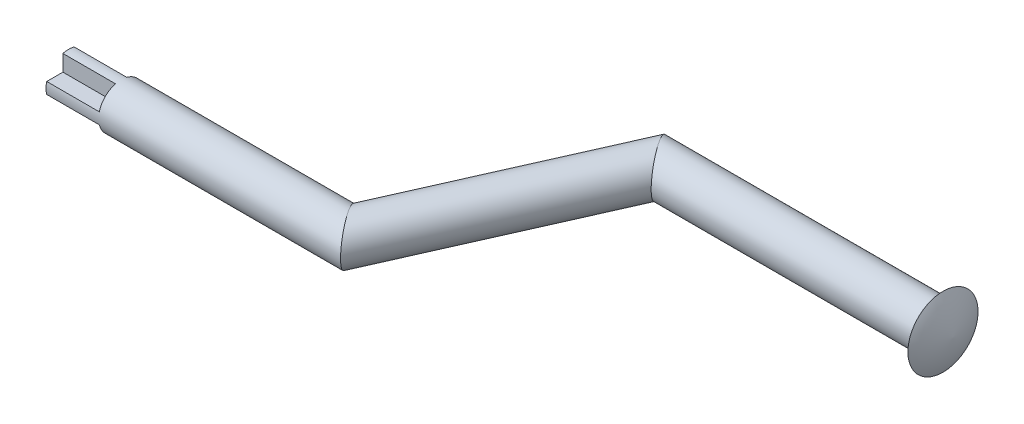
ISO-10303-21;
HEADER;
FILE_DESCRIPTION(('STEP AP214'),'2;1');
FILE_NAME('part.step','',(''),(''),'','','');
FILE_SCHEMA(('AUTOMOTIVE_DESIGN { 1 0 10303 214 1 1 1 1 }'));
ENDSEC;
DATA;
#1=APPLICATION_CONTEXT('core data for automotive mechanical design processes');
#2=APPLICATION_PROTOCOL_DEFINITION('international standard','automotive_design',2000,#1);
#3=PRODUCT_CONTEXT('',#1,'mechanical');
#4=PRODUCT('Part','Part','',(#3));
#5=PRODUCT_RELATED_PRODUCT_CATEGORY('part','',(#4));
#6=PRODUCT_DEFINITION_FORMATION('','',#4);
#7=PRODUCT_DEFINITION_CONTEXT('part definition',#1,'design');
#8=PRODUCT_DEFINITION('design','',#6,#7);
#9=PRODUCT_DEFINITION_SHAPE('','',#8);
#10=(LENGTH_UNIT() NAMED_UNIT(*) SI_UNIT(.MILLI.,.METRE.));
#11=(NAMED_UNIT(*) PLANE_ANGLE_UNIT() SI_UNIT($,.RADIAN.));
#12=(NAMED_UNIT(*) SI_UNIT($,.STERADIAN.) SOLID_ANGLE_UNIT());
#13=UNCERTAINTY_MEASURE_WITH_UNIT(LENGTH_MEASURE(1.E-05),#10,'distance_accuracy_value','');
#14=(GEOMETRIC_REPRESENTATION_CONTEXT(3) GLOBAL_UNCERTAINTY_ASSIGNED_CONTEXT((#13)) GLOBAL_UNIT_ASSIGNED_CONTEXT((#10,
#11,#12)) REPRESENTATION_CONTEXT('',''));
#15=CARTESIAN_POINT('',(0.,0.,0.));
#16=DIRECTION('',(0.,0.,1.));
#17=DIRECTION('',(1.,0.,0.));
#18=AXIS2_PLACEMENT_3D('',#15,#16,#17);
#19=CARTESIAN_POINT('',(-222.882267398916,0.,72.7461736455126));
#20=DIRECTION('',(1.,0.,0.));
#21=DIRECTION('',(0.,0.,-1.));
#22=AXIS2_PLACEMENT_3D('',#19,#20,#21);
#23=PLANE('',#22);
#24=DIRECTION('',(0.,0.,1.));
#25=VECTOR('',#24,1.);
#26=CARTESIAN_POINT('',(-222.882267398916,-1.905,65.3681403709875));
#27=LINE('',#26,#25);
#28=CARTESIAN_POINT('',(-222.882267398916,-1.905,65.3681403709875));
#29=VERTEX_POINT('',#28);
#30=CARTESIAN_POINT('',(-222.882267398916,-1.905,70.8411736455126));
#31=VERTEX_POINT('',#30);
#32=EDGE_CURVE('E146',#29,#31,#27,.T.);
#33=ORIENTED_EDGE('',*,*,#32,.T.);
#34=DIRECTION('',(0.,-1.,0.));
#35=VECTOR('',#34,1.);
#36=CARTESIAN_POINT('',(-222.882267398916,-1.905,70.8411736455126));
#37=LINE('',#36,#35);
#38=CARTESIAN_POINT('',(-222.882267398916,-7.37803327452513,70.8411736455126));
#39=VERTEX_POINT('',#38);
#40=EDGE_CURVE('E390',#31,#39,#37,.T.);
#41=ORIENTED_EDGE('',*,*,#40,.T.);
#42=CARTESIAN_POINT('',(-222.882267398916,0.,72.7461736455126));
#43=DIRECTION('',(1.,0.,0.));
#44=DIRECTION('',(0.,0.,-1.));
#45=AXIS2_PLACEMENT_3D('',#42,#43,#44);
#46=CIRCLE('',#45,7.62);
#47=CARTESIAN_POINT('',(-222.882267398916,-7.37803327452513,74.6511736455126));
#48=VERTEX_POINT('',#47);
#49=EDGE_CURVE('E152',#48,#39,#46,.T.);
#50=ORIENTED_EDGE('',*,*,#49,.F.);
#51=DIRECTION('',(0.,1.,0.));
#52=VECTOR('',#51,1.);
#53=CARTESIAN_POINT('',(-222.882267398916,-1.905,74.6511736455126));
#54=LINE('',#53,#52);
#55=CARTESIAN_POINT('',(-222.882267398916,-1.905,74.6511736455126));
#56=VERTEX_POINT('',#55);
#57=EDGE_CURVE('E181',#48,#56,#54,.T.);
#58=ORIENTED_EDGE('',*,*,#57,.T.);
#59=DIRECTION('',(0.,0.,1.));
#60=VECTOR('',#59,1.);
#61=CARTESIAN_POINT('',(-222.882267398916,-1.905,80.1242069200378));
#62=LINE('',#61,#60);
#63=CARTESIAN_POINT('',(-222.882267398916,-1.905,80.1242069200378));
#64=VERTEX_POINT('',#63);
#65=EDGE_CURVE('E172',#56,#64,#62,.T.);
#66=ORIENTED_EDGE('',*,*,#65,.T.);
#67=CARTESIAN_POINT('',(-222.882267398916,1.905,80.1242069200378));
#68=VERTEX_POINT('',#67);
#69=EDGE_CURVE('E39',#68,#64,#46,.T.);
#70=ORIENTED_EDGE('',*,*,#69,.F.);
#71=DIRECTION('',(0.,0.,1.));
#72=VECTOR('',#71,1.);
#73=CARTESIAN_POINT('',(-222.882267398916,1.905,80.1242069200378));
#74=LINE('',#73,#72);
#75=CARTESIAN_POINT('',(-222.882267398916,1.905,74.6511736455126));
#76=VERTEX_POINT('',#75);
#77=EDGE_CURVE('E200',#76,#68,#74,.T.);
#78=ORIENTED_EDGE('',*,*,#77,.F.);
#79=DIRECTION('',(0.,-1.,0.));
#80=VECTOR('',#79,1.);
#81=CARTESIAN_POINT('',(-222.882267398916,1.905,74.6511736455126));
#82=LINE('',#81,#80);
#83=CARTESIAN_POINT('',(-222.882267398916,7.37803327452513,74.6511736455126));
#84=VERTEX_POINT('',#83);
#85=EDGE_CURVE('E192',#84,#76,#82,.T.);
#86=ORIENTED_EDGE('',*,*,#85,.F.);
#87=CARTESIAN_POINT('',(-222.882267398916,7.37803327452513,70.8411736455126));
#88=VERTEX_POINT('',#87);
#89=EDGE_CURVE('E219',#88,#84,#46,.T.);
#90=ORIENTED_EDGE('',*,*,#89,.F.);
#91=DIRECTION('',(0.,1.,0.));
#92=VECTOR('',#91,1.);
#93=CARTESIAN_POINT('',(-222.882267398916,1.905,70.8411736455126));
#94=LINE('',#93,#92);
#95=CARTESIAN_POINT('',(-222.882267398916,1.905,70.8411736455126));
#96=VERTEX_POINT('',#95);
#97=EDGE_CURVE('E161',#96,#88,#94,.T.);
#98=ORIENTED_EDGE('',*,*,#97,.F.);
#99=DIRECTION('',(0.,0.,1.));
#100=VECTOR('',#99,1.);
#101=CARTESIAN_POINT('',(-222.882267398916,1.905,65.3681403709875));
#102=LINE('',#101,#100);
#103=CARTESIAN_POINT('',(-222.882267398916,1.905,65.3681403709875));
#104=VERTEX_POINT('',#103);
#105=EDGE_CURVE('E165',#104,#96,#102,.T.);
#106=ORIENTED_EDGE('',*,*,#105,.F.);
#107=EDGE_CURVE('E226',#29,#104,#46,.T.);
#108=ORIENTED_EDGE('',*,*,#107,.F.);
#109=EDGE_LOOP('',(#33,#41,#50,#58,#66,#70,#78,#86,#90,#98,#106,#108));
#110=FACE_BOUND('',#109,.T.);
#111=ADVANCED_FACE('F36',(#110),#23,.F.);
#112=CARTESIAN_POINT('',(-122.700996640822,0.,72.7461736455126));
#113=DIRECTION('',(-1.,0.,0.));
#114=DIRECTION('',(0.,0.,1.));
#115=AXIS2_PLACEMENT_3D('',#112,#113,#114);
#116=CYLINDRICAL_SURFACE('',#115,7.62);
#117=CARTESIAN_POINT('',(-128.252610357535,0.,72.7461736455126));
#118=DIRECTION('',(-0.838292149650602,0.,0.545221305374408));
#119=DIRECTION('',(0.545221305374408,0.,0.838292149650602));
#120=AXIS2_PLACEMENT_3D('',#117,#118,#119);
#121=ELLIPSE('',#120,9.08990976854071,7.62);
#122=CARTESIAN_POINT('',(-123.296597887796,0.,80.3661736455126));
#123=VERTEX_POINT('',#122);
#124=EDGE_CURVE('E221',#123,#123,#121,.T.);
#125=ORIENTED_EDGE('',*,*,#124,.T.);
#126=EDGE_LOOP('',(#125));
#127=FACE_BOUND('',#126,.T.);
#128=DIRECTION('',(-1.,0.,0.));
#129=VECTOR('',#128,1.);
#130=CARTESIAN_POINT('',(-205.102267398916,-1.905,65.3681403709875));
#131=LINE('',#130,#129);
#132=CARTESIAN_POINT('',(-205.102267398916,-1.90499999999999,65.3681403709875));
#133=VERTEX_POINT('',#132);
#134=EDGE_CURVE('E52',#133,#29,#131,.T.);
#135=ORIENTED_EDGE('',*,*,#134,.T.);
#136=ORIENTED_EDGE('',*,*,#107,.T.);
#137=DIRECTION('',(-1.,0.,0.));
#138=VECTOR('',#137,1.);
#139=CARTESIAN_POINT('',(-205.102267398916,1.905,65.3681403709875));
#140=LINE('',#139,#138);
#141=CARTESIAN_POINT('',(-205.102267398916,1.905,65.3681403709875));
#142=VERTEX_POINT('',#141);
#143=EDGE_CURVE('E164',#142,#104,#140,.T.);
#144=ORIENTED_EDGE('',*,*,#143,.F.);
#145=CARTESIAN_POINT('',(-205.102267398916,0.,72.7461736455126));
#146=DIRECTION('',(-1.,0.,0.));
#147=DIRECTION('',(0.,0.,-1.));
#148=AXIS2_PLACEMENT_3D('',#145,#146,#147);
#149=CIRCLE('',#148,7.62000000000001);
#150=CARTESIAN_POINT('',(-205.102267398916,7.37803327452513,70.8411736455126));
#151=VERTEX_POINT('',#150);
#152=EDGE_CURVE('E158',#151,#142,#149,.T.);
#153=ORIENTED_EDGE('',*,*,#152,.F.);
#154=DIRECTION('',(-1.,0.,0.));
#155=VECTOR('',#154,1.);
#156=CARTESIAN_POINT('',(-205.102267398916,7.37803327452513,70.8411736455126));
#157=LINE('',#156,#155);
#158=EDGE_CURVE('E169',#151,#88,#157,.T.);
#159=ORIENTED_EDGE('',*,*,#158,.T.);
#160=ORIENTED_EDGE('',*,*,#89,.T.);
#161=DIRECTION('',(-1.,0.,0.));
#162=VECTOR('',#161,1.);
#163=CARTESIAN_POINT('',(-205.102267398916,7.37803327452513,74.6511736455126));
#164=LINE('',#163,#162);
#165=CARTESIAN_POINT('',(-205.102267398916,7.37803327452513,74.6511736455126));
#166=VERTEX_POINT('',#165);
#167=EDGE_CURVE('E205',#166,#84,#164,.T.);
#168=ORIENTED_EDGE('',*,*,#167,.F.);
#169=CARTESIAN_POINT('',(-205.102267398916,0.,72.7461736455126));
#170=DIRECTION('',(-1.,0.,0.));
#171=DIRECTION('',(0.,0.,-1.));
#172=AXIS2_PLACEMENT_3D('',#169,#170,#171);
#173=CIRCLE('',#172,7.62000000000001);
#174=CARTESIAN_POINT('',(-205.102267398916,1.905,80.1242069200378));
#175=VERTEX_POINT('',#174);
#176=EDGE_CURVE('E196',#175,#166,#173,.T.);
#177=ORIENTED_EDGE('',*,*,#176,.F.);
#178=DIRECTION('',(-1.,0.,0.));
#179=VECTOR('',#178,1.);
#180=CARTESIAN_POINT('',(-205.102267398916,1.905,80.1242069200378));
#181=LINE('',#180,#179);
#182=EDGE_CURVE('E209',#175,#68,#181,.T.);
#183=ORIENTED_EDGE('',*,*,#182,.T.);
#184=ORIENTED_EDGE('',*,*,#69,.T.);
#185=DIRECTION('',(-1.,0.,0.));
#186=VECTOR('',#185,1.);
#187=CARTESIAN_POINT('',(-205.102267398916,-1.905,80.1242069200378));
#188=LINE('',#187,#186);
#189=CARTESIAN_POINT('',(-205.102267398916,-1.905,80.1242069200378));
#190=VERTEX_POINT('',#189);
#191=EDGE_CURVE('E185',#190,#64,#188,.T.);
#192=ORIENTED_EDGE('',*,*,#191,.F.);
#193=CARTESIAN_POINT('',(-205.102267398916,0.,72.7461736455126));
#194=DIRECTION('',(1.,0.,0.));
#195=DIRECTION('',(0.,0.,-1.));
#196=AXIS2_PLACEMENT_3D('',#193,#194,#195);
#197=CIRCLE('',#196,7.62000000000001);
#198=CARTESIAN_POINT('',(-205.102267398916,-7.37803327452513,74.6511736455126));
#199=VERTEX_POINT('',#198);
#200=EDGE_CURVE('E177',#190,#199,#197,.T.);
#201=ORIENTED_EDGE('',*,*,#200,.T.);
#202=DIRECTION('',(-1.,0.,0.));
#203=VECTOR('',#202,1.);
#204=CARTESIAN_POINT('',(-205.102267398916,-7.37803327452513,74.6511736455126));
#205=LINE('',#204,#203);
#206=EDGE_CURVE('E190',#199,#48,#205,.T.);
#207=ORIENTED_EDGE('',*,*,#206,.T.);
#208=ORIENTED_EDGE('',*,*,#49,.T.);
#209=DIRECTION('',(-1.,0.,0.));
#210=VECTOR('',#209,1.);
#211=CARTESIAN_POINT('',(-205.102267398916,-7.37803327452513,70.8411736455126));
#212=LINE('',#211,#210);
#213=CARTESIAN_POINT('',(-205.102267398916,-7.37803327452513,70.8411736455126));
#214=VERTEX_POINT('',#213);
#215=EDGE_CURVE('E136',#214,#39,#212,.T.);
#216=ORIENTED_EDGE('',*,*,#215,.F.);
#217=CARTESIAN_POINT('',(-205.102267398916,0.,72.7461736455126));
#218=DIRECTION('',(1.,0.,0.));
#219=DIRECTION('',(0.,0.,-1.));
#220=AXIS2_PLACEMENT_3D('',#217,#218,#219);
#221=CIRCLE('',#220,7.62000000000001);
#222=EDGE_CURVE('E141',#214,#133,#221,.T.);
#223=ORIENTED_EDGE('',*,*,#222,.T.);
#224=EDGE_LOOP('',(#135,#136,#144,#153,#159,#160,#168,#177,#183,#184,#192,#201,#207,#208,#216,#223));
#225=FACE_BOUND('',#224,.T.);
#226=ADVANCED_FACE('F149',(#127,#225),#116,.T.);
#227=CARTESIAN_POINT('',(-93.7339165765986,0.,-5.07478272905161));
#228=DIRECTION('',(-0.405467456331653,0.,0.914109480235239));
#229=DIRECTION('',(0.914109480235239,0.,0.405467456331653));
#230=AXIS2_PLACEMENT_3D('',#227,#228,#229);
#231=CYLINDRICAL_SURFACE('',#230,7.62);
#232=CARTESIAN_POINT('',(-95.9849152688503,0.,0.));
#233=DIRECTION('',(-0.838292149650602,0.,0.545221305374408));
#234=DIRECTION('',(-0.545221305374408,0.,-0.838292149650602));
#235=AXIS2_PLACEMENT_3D('',#232,#233,#234);
#236=ELLIPSE('',#235,9.08990976854071,7.62);
#237=CARTESIAN_POINT('',(-100.94092773859,0.,-7.62));
#238=VERTEX_POINT('',#237);
#239=EDGE_CURVE('E11',#238,#238,#236,.T.);
#240=ORIENTED_EDGE('',*,*,#239,.T.);
#241=EDGE_LOOP('',(#240));
#242=FACE_BOUND('',#241,.T.);
#243=ORIENTED_EDGE('',*,*,#124,.F.);
#244=EDGE_LOOP('',(#243));
#245=FACE_BOUND('',#244,.T.);
#246=ADVANCED_FACE('F265',(#242,#245),#231,.T.);
#247=CARTESIAN_POINT('',(0.,0.,0.));
#248=DIRECTION('',(-1.,0.,0.));
#249=DIRECTION('',(0.,0.,1.));
#250=AXIS2_PLACEMENT_3D('',#247,#248,#249);
#251=CYLINDRICAL_SURFACE('',#250,7.62);
#252=CARTESIAN_POINT('',(0.,0.,0.));
#253=DIRECTION('',(1.,0.,0.));
#254=DIRECTION('',(0.,0.,-1.));
#255=AXIS2_PLACEMENT_3D('',#252,#253,#254);
#256=CIRCLE('',#255,7.62);
#257=CARTESIAN_POINT('',(0.,0.,-7.62));
#258=VERTEX_POINT('',#257);
#259=EDGE_CURVE('E44',#258,#258,#256,.T.);
#260=ORIENTED_EDGE('',*,*,#259,.F.);
#261=EDGE_LOOP('',(#260));
#262=FACE_BOUND('',#261,.T.);
#263=ORIENTED_EDGE('',*,*,#239,.F.);
#264=EDGE_LOOP('',(#263));
#265=FACE_BOUND('',#264,.T.);
#266=ADVANCED_FACE('F266',(#262,#265),#251,.T.);
#267=CARTESIAN_POINT('',(0.,0.,0.));
#268=DIRECTION('',(1.,0.,0.));
#269=DIRECTION('',(0.,0.,-1.));
#270=AXIS2_PLACEMENT_3D('',#267,#268,#269);
#271=PLANE('',#270);
#272=ORIENTED_EDGE('',*,*,#259,.T.);
#273=EDGE_LOOP('',(#272));
#274=FACE_BOUND('',#273,.T.);
#275=CARTESIAN_POINT('',(0.,0.,0.));
#276=DIRECTION('',(-1.,0.,0.));
#277=DIRECTION('',(0.,0.,1.));
#278=AXIS2_PLACEMENT_3D('',#275,#276,#277);
#279=CIRCLE('',#278,11.8604605662378);
#280=CARTESIAN_POINT('',(0.,0.,11.8604605662378));
#281=VERTEX_POINT('',#280);
#282=EDGE_CURVE('E212',#281,#281,#279,.T.);
#283=ORIENTED_EDGE('',*,*,#282,.T.);
#284=EDGE_LOOP('',(#283));
#285=FACE_BOUND('',#284,.T.);
#286=ADVANCED_FACE('F272',(#274,#285),#271,.F.);
#287=CARTESIAN_POINT('',(-27.0940917383905,0.,-2.34195249865787));
#288=DIRECTION('',(0.,-1.,0.));
#289=DIRECTION('',(0.,0.,1.));
#290=AXIS2_PLACEMENT_3D('',#287,#288,#289);
#291=CIRCLE('',#290,30.5908212376562);
#292=TRIMMED_CURVE('',#291,(PARAMETER_VALUE(-1.49416398521679)),
(PARAMETER_VALUE(1.49416398521679)),.T.,.PARAMETER.);
#293=CARTESIAN_POINT('',(-27.0940917383905,0.,0.));
#294=DIRECTION('',(-1.,0.,0.));
#295=AXIS1_PLACEMENT('',#293,#294);
#296=SURFACE_OF_REVOLUTION('',#292,#295);
#297=ORIENTED_EDGE('',*,*,#282,.F.);
#298=EDGE_LOOP('',(#297));
#299=FACE_BOUND('',#298,.T.);
#300=CARTESIAN_POINT('',(3.40695090753014,0.,0.));
#301=VERTEX_POINT('',#300);
#302=VERTEX_LOOP('',#301);
#303=FACE_BOUND('',#302,.T.);
#304=ADVANCED_FACE('F279',(#299,#303),#296,.T.);
#305=CARTESIAN_POINT('',(-205.102267398916,1.905,80.1242069200378));
#306=DIRECTION('',(0.,-1.,0.));
#307=DIRECTION('',(0.,0.,-1.));
#308=AXIS2_PLACEMENT_3D('',#305,#306,#307);
#309=PLANE('',#308);
#310=ORIENTED_EDGE('',*,*,#77,.T.);
#311=ORIENTED_EDGE('',*,*,#182,.F.);
#312=DIRECTION('',(0.,0.,1.));
#313=VECTOR('',#312,1.);
#314=CARTESIAN_POINT('',(-205.102267398916,1.905,80.1242069200378));
#315=LINE('',#314,#313);
#316=CARTESIAN_POINT('',(-205.102267398916,1.905,74.6511736455126));
#317=VERTEX_POINT('',#316);
#318=EDGE_CURVE('E203',#317,#175,#315,.T.);
#319=ORIENTED_EDGE('',*,*,#318,.F.);
#320=DIRECTION('',(-1.,0.,0.));
#321=VECTOR('',#320,1.);
#322=CARTESIAN_POINT('',(-205.102267398916,1.905,74.6511736455126));
#323=LINE('',#322,#321);
#324=EDGE_CURVE('E213',#317,#76,#323,.T.);
#325=ORIENTED_EDGE('',*,*,#324,.T.);
#326=EDGE_LOOP('',(#310,#311,#319,#325));
#327=FACE_BOUND('',#326,.T.);
#328=ADVANCED_FACE('F244',(#327),#309,.F.);
#329=CARTESIAN_POINT('',(-205.102267398916,1.905,74.6511736455126));
#330=DIRECTION('',(0.,0.,-1.));
#331=DIRECTION('',(-1.,0.,0.));
#332=AXIS2_PLACEMENT_3D('',#329,#330,#331);
#333=PLANE('',#332);
#334=ORIENTED_EDGE('',*,*,#85,.T.);
#335=ORIENTED_EDGE('',*,*,#324,.F.);
#336=DIRECTION('',(0.,-1.,0.));
#337=VECTOR('',#336,1.);
#338=CARTESIAN_POINT('',(-205.102267398916,1.905,74.6511736455126));
#339=LINE('',#338,#337);
#340=EDGE_CURVE('E199',#166,#317,#339,.T.);
#341=ORIENTED_EDGE('',*,*,#340,.F.);
#342=ORIENTED_EDGE('',*,*,#167,.T.);
#343=EDGE_LOOP('',(#334,#335,#341,#342));
#344=FACE_BOUND('',#343,.T.);
#345=ADVANCED_FACE('F239',(#344),#333,.F.);
#346=CARTESIAN_POINT('',(-205.102267398916,0.,72.7461736455126));
#347=DIRECTION('',(1.,0.,0.));
#348=DIRECTION('',(0.,0.,-1.));
#349=AXIS2_PLACEMENT_3D('',#346,#347,#348);
#350=PLANE('',#349);
#351=ORIENTED_EDGE('',*,*,#176,.T.);
#352=ORIENTED_EDGE('',*,*,#340,.T.);
#353=ORIENTED_EDGE('',*,*,#318,.T.);
#354=EDGE_LOOP('',(#351,#352,#353));
#355=FACE_BOUND('',#354,.T.);
#356=ADVANCED_FACE('F247',(#355),#350,.F.);
#357=CARTESIAN_POINT('',(-205.102267398916,-1.905,74.6511736455126));
#358=DIRECTION('',(0.,0.,1.));
#359=DIRECTION('',(1.,0.,0.));
#360=AXIS2_PLACEMENT_3D('',#357,#358,#359);
#361=PLANE('',#360);
#362=ORIENTED_EDGE('',*,*,#57,.F.);
#363=ORIENTED_EDGE('',*,*,#206,.F.);
#364=DIRECTION('',(0.,1.,0.));
#365=VECTOR('',#364,1.);
#366=CARTESIAN_POINT('',(-205.102267398916,-1.905,74.6511736455126));
#367=LINE('',#366,#365);
#368=CARTESIAN_POINT('',(-205.102267398916,-1.905,74.6511736455126));
#369=VERTEX_POINT('',#368);
#370=EDGE_CURVE('E183',#199,#369,#367,.T.);
#371=ORIENTED_EDGE('',*,*,#370,.T.);
#372=DIRECTION('',(-1.,0.,0.));
#373=VECTOR('',#372,1.);
#374=CARTESIAN_POINT('',(-205.102267398916,-1.905,74.6511736455126));
#375=LINE('',#374,#373);
#376=EDGE_CURVE('E193',#369,#56,#375,.T.);
#377=ORIENTED_EDGE('',*,*,#376,.T.);
#378=EDGE_LOOP('',(#362,#363,#371,#377));
#379=FACE_BOUND('',#378,.T.);
#380=ADVANCED_FACE('F249',(#379),#361,.T.);
#381=CARTESIAN_POINT('',(-205.102267398916,-1.905,80.1242069200378));
#382=DIRECTION('',(0.,-1.,0.));
#383=DIRECTION('',(0.,0.,-1.));
#384=AXIS2_PLACEMENT_3D('',#381,#382,#383);
#385=PLANE('',#384);
#386=ORIENTED_EDGE('',*,*,#65,.F.);
#387=ORIENTED_EDGE('',*,*,#376,.F.);
#388=DIRECTION('',(0.,0.,1.));
#389=VECTOR('',#388,1.);
#390=CARTESIAN_POINT('',(-205.102267398916,-1.905,80.1242069200378));
#391=LINE('',#390,#389);
#392=EDGE_CURVE('E180',#369,#190,#391,.T.);
#393=ORIENTED_EDGE('',*,*,#392,.T.);
#394=ORIENTED_EDGE('',*,*,#191,.T.);
#395=EDGE_LOOP('',(#386,#387,#393,#394));
#396=FACE_BOUND('',#395,.T.);
#397=ADVANCED_FACE('F255',(#396),#385,.T.);
#398=CARTESIAN_POINT('',(-205.102267398916,0.,72.7461736455126));
#399=DIRECTION('',(1.,0.,0.));
#400=DIRECTION('',(0.,0.,-1.));
#401=AXIS2_PLACEMENT_3D('',#398,#399,#400);
#402=PLANE('',#401);
#403=ORIENTED_EDGE('',*,*,#200,.F.);
#404=ORIENTED_EDGE('',*,*,#392,.F.);
#405=ORIENTED_EDGE('',*,*,#370,.F.);
#406=EDGE_LOOP('',(#403,#404,#405));
#407=FACE_BOUND('',#406,.T.);
#408=ADVANCED_FACE('F315',(#407),#402,.F.);
#409=CARTESIAN_POINT('',(-205.102267398916,1.905,70.8411736455126));
#410=DIRECTION('',(0.,0.,1.));
#411=DIRECTION('',(0.,-1.,0.));
#412=AXIS2_PLACEMENT_3D('',#409,#410,#411);
#413=PLANE('',#412);
#414=ORIENTED_EDGE('',*,*,#97,.T.);
#415=ORIENTED_EDGE('',*,*,#158,.F.);
#416=DIRECTION('',(0.,1.,0.));
#417=VECTOR('',#416,1.);
#418=CARTESIAN_POINT('',(-205.102267398916,1.905,70.8411736455126));
#419=LINE('',#418,#417);
#420=CARTESIAN_POINT('',(-205.102267398916,1.905,70.8411736455126));
#421=VERTEX_POINT('',#420);
#422=EDGE_CURVE('E60',#421,#151,#419,.T.);
#423=ORIENTED_EDGE('',*,*,#422,.F.);
#424=DIRECTION('',(-1.,0.,0.));
#425=VECTOR('',#424,1.);
#426=CARTESIAN_POINT('',(-205.102267398916,1.905,70.8411736455126));
#427=LINE('',#426,#425);
#428=EDGE_CURVE('E173',#421,#96,#427,.T.);
#429=ORIENTED_EDGE('',*,*,#428,.T.);
#430=EDGE_LOOP('',(#414,#415,#423,#429));
#431=FACE_BOUND('',#430,.T.);
#432=ADVANCED_FACE('F324',(#431),#413,.F.);
#433=CARTESIAN_POINT('',(-205.102267398916,1.905,65.3681403709875));
#434=DIRECTION('',(0.,-1.,0.));
#435=DIRECTION('',(0.,0.,-1.));
#436=AXIS2_PLACEMENT_3D('',#433,#434,#435);
#437=PLANE('',#436);
#438=ORIENTED_EDGE('',*,*,#105,.T.);
#439=ORIENTED_EDGE('',*,*,#428,.F.);
#440=DIRECTION('',(0.,0.,1.));
#441=VECTOR('',#440,1.);
#442=CARTESIAN_POINT('',(-205.102267398916,1.905,65.3681403709875));
#443=LINE('',#442,#441);
#444=EDGE_CURVE('E160',#142,#421,#443,.T.);
#445=ORIENTED_EDGE('',*,*,#444,.F.);
#446=ORIENTED_EDGE('',*,*,#143,.T.);
#447=EDGE_LOOP('',(#438,#439,#445,#446));
#448=FACE_BOUND('',#447,.T.);
#449=ADVANCED_FACE('F334',(#448),#437,.F.);
#450=CARTESIAN_POINT('',(-205.102267398916,0.,72.7461736455126));
#451=DIRECTION('',(1.,0.,0.));
#452=DIRECTION('',(0.,0.,-1.));
#453=AXIS2_PLACEMENT_3D('',#450,#451,#452);
#454=PLANE('',#453);
#455=ORIENTED_EDGE('',*,*,#152,.T.);
#456=ORIENTED_EDGE('',*,*,#444,.T.);
#457=ORIENTED_EDGE('',*,*,#422,.T.);
#458=EDGE_LOOP('',(#455,#456,#457));
#459=FACE_BOUND('',#458,.T.);
#460=ADVANCED_FACE('F344',(#459),#454,.F.);
#461=CARTESIAN_POINT('',(-205.102267398916,-1.905,65.3681403709875));
#462=DIRECTION('',(0.,-1.,0.));
#463=DIRECTION('',(0.,0.,-1.));
#464=AXIS2_PLACEMENT_3D('',#461,#462,#463);
#465=PLANE('',#464);
#466=ORIENTED_EDGE('',*,*,#32,.F.);
#467=ORIENTED_EDGE('',*,*,#134,.F.);
#468=DIRECTION('',(0.,0.,1.));
#469=VECTOR('',#468,1.);
#470=CARTESIAN_POINT('',(-205.102267398916,-1.905,65.3681403709875));
#471=LINE('',#470,#469);
#472=CARTESIAN_POINT('',(-205.102267398916,-1.905,70.8411736455126));
#473=VERTEX_POINT('',#472);
#474=EDGE_CURVE('E140',#133,#473,#471,.T.);
#475=ORIENTED_EDGE('',*,*,#474,.T.);
#476=DIRECTION('',(-1.,0.,0.));
#477=VECTOR('',#476,1.);
#478=CARTESIAN_POINT('',(-205.102267398916,-1.905,70.8411736455126));
#479=LINE('',#478,#477);
#480=EDGE_CURVE('E138',#473,#31,#479,.T.);
#481=ORIENTED_EDGE('',*,*,#480,.T.);
#482=EDGE_LOOP('',(#466,#467,#475,#481));
#483=FACE_BOUND('',#482,.T.);
#484=ADVANCED_FACE('F353',(#483),#465,.T.);
#485=CARTESIAN_POINT('',(-205.102267398916,-1.905,70.8411736455126));
#486=DIRECTION('',(0.,0.,-1.));
#487=DIRECTION('',(0.,1.,0.));
#488=AXIS2_PLACEMENT_3D('',#485,#486,#487);
#489=PLANE('',#488);
#490=ORIENTED_EDGE('',*,*,#40,.F.);
#491=ORIENTED_EDGE('',*,*,#480,.F.);
#492=DIRECTION('',(0.,-1.,0.));
#493=VECTOR('',#492,1.);
#494=CARTESIAN_POINT('',(-205.102267398916,-1.905,70.8411736455126));
#495=LINE('',#494,#493);
#496=EDGE_CURVE('E131',#473,#214,#495,.T.);
#497=ORIENTED_EDGE('',*,*,#496,.T.);
#498=ORIENTED_EDGE('',*,*,#215,.T.);
#499=EDGE_LOOP('',(#490,#491,#497,#498));
#500=FACE_BOUND('',#499,.T.);
#501=ADVANCED_FACE('F134',(#500),#489,.T.);
#502=CARTESIAN_POINT('',(-205.102267398916,0.,72.7461736455126));
#503=DIRECTION('',(1.,0.,0.));
#504=DIRECTION('',(0.,0.,-1.));
#505=AXIS2_PLACEMENT_3D('',#502,#503,#504);
#506=PLANE('',#505);
#507=ORIENTED_EDGE('',*,*,#222,.F.);
#508=ORIENTED_EDGE('',*,*,#496,.F.);
#509=ORIENTED_EDGE('',*,*,#474,.F.);
#510=EDGE_LOOP('',(#507,#508,#509));
#511=FACE_BOUND('',#510,.T.);
#512=ADVANCED_FACE('F144',(#511),#506,.F.);
#513=CLOSED_SHELL('',(#111,#226,#246,#266,#286,#304,#328,#345,#356,#380,#397,#408,#432,#449,
#460,#484,#501,#512));
#514=MANIFOLD_SOLID_BREP('B2',#513);
#515=ADVANCED_BREP_SHAPE_REPRESENTATION('',(#18,#514),#14);
#516=SHAPE_DEFINITION_REPRESENTATION(#9,#515);
ENDSEC;
END-ISO-10303-21;
